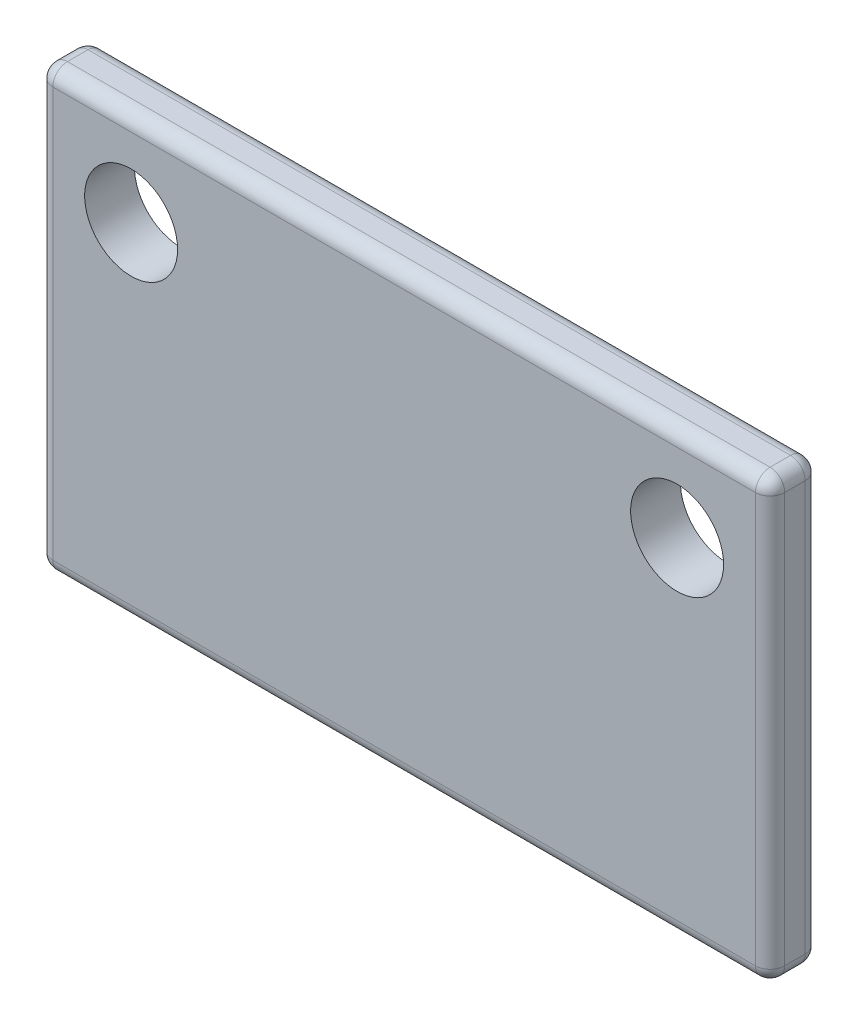
ISO-10303-21;
HEADER;
FILE_DESCRIPTION(('STEP AP214'),'2;1');
FILE_NAME('part.step','',(''),(''),'','','');
FILE_SCHEMA(('AUTOMOTIVE_DESIGN { 1 0 10303 214 1 1 1 1 }'));
ENDSEC;
DATA;
#1=APPLICATION_CONTEXT('core data for automotive mechanical design processes');
#2=APPLICATION_PROTOCOL_DEFINITION('international standard','automotive_design',2000,#1);
#3=PRODUCT_CONTEXT('',#1,'mechanical');
#4=PRODUCT('Part','Part','',(#3));
#5=PRODUCT_RELATED_PRODUCT_CATEGORY('part','',(#4));
#6=PRODUCT_DEFINITION_FORMATION('','',#4);
#7=PRODUCT_DEFINITION_CONTEXT('part definition',#1,'design');
#8=PRODUCT_DEFINITION('design','',#6,#7);
#9=PRODUCT_DEFINITION_SHAPE('','',#8);
#10=(LENGTH_UNIT() NAMED_UNIT(*) SI_UNIT(.MILLI.,.METRE.));
#11=(NAMED_UNIT(*) PLANE_ANGLE_UNIT() SI_UNIT($,.RADIAN.));
#12=(NAMED_UNIT(*) SI_UNIT($,.STERADIAN.) SOLID_ANGLE_UNIT());
#13=UNCERTAINTY_MEASURE_WITH_UNIT(LENGTH_MEASURE(1.E-05),#10,'distance_accuracy_value','');
#14=(GEOMETRIC_REPRESENTATION_CONTEXT(3) GLOBAL_UNCERTAINTY_ASSIGNED_CONTEXT((#13)) GLOBAL_UNIT_ASSIGNED_CONTEXT((#10,
#11,#12)) REPRESENTATION_CONTEXT('',''));
#15=CARTESIAN_POINT('',(0.,0.,0.));
#16=DIRECTION('',(0.,0.,1.));
#17=DIRECTION('',(1.,0.,0.));
#18=AXIS2_PLACEMENT_3D('',#15,#16,#17);
#19=CARTESIAN_POINT('',(-12.5,-7.5,1.7));
#20=DIRECTION('',(1.,0.,0.));
#21=DIRECTION('',(0.,0.,-1.));
#22=AXIS2_PLACEMENT_3D('',#19,#20,#21);
#23=PLANE('',#22);
#24=DIRECTION('',(0.,-1.,0.));
#25=VECTOR('',#24,1.);
#26=CARTESIAN_POINT('',(-12.5,7.5,1.2));
#27=LINE('',#26,#25);
#28=CARTESIAN_POINT('',(-12.5,-7.,1.2));
#29=VERTEX_POINT('',#28);
#30=CARTESIAN_POINT('',(-12.5,7.,1.2));
#31=VERTEX_POINT('',#30);
#32=EDGE_CURVE('E134',#29,#31,#27,.F.);
#33=ORIENTED_EDGE('',*,*,#32,.T.);
#34=DIRECTION('',(0.,0.,-1.));
#35=VECTOR('',#34,1.);
#36=CARTESIAN_POINT('',(-12.5,7.,1.7));
#37=LINE('',#36,#35);
#38=CARTESIAN_POINT('',(-12.5,7.,0.5));
#39=VERTEX_POINT('',#38);
#40=EDGE_CURVE('E130',#31,#39,#37,.T.);
#41=ORIENTED_EDGE('',*,*,#40,.T.);
#42=DIRECTION('',(0.,-1.,0.));
#43=VECTOR('',#42,1.);
#44=CARTESIAN_POINT('',(-12.5,-7.5,0.5));
#45=LINE('',#44,#43);
#46=CARTESIAN_POINT('',(-12.5,-7.,0.5));
#47=VERTEX_POINT('',#46);
#48=EDGE_CURVE('E125',#39,#47,#45,.T.);
#49=ORIENTED_EDGE('',*,*,#48,.T.);
#50=DIRECTION('',(0.,0.,-1.));
#51=VECTOR('',#50,1.);
#52=CARTESIAN_POINT('',(-12.5,-7.,1.7));
#53=LINE('',#52,#51);
#54=EDGE_CURVE('E127',#47,#29,#53,.F.);
#55=ORIENTED_EDGE('',*,*,#54,.T.);
#56=EDGE_LOOP('',(#33,#41,#49,#55));
#57=FACE_BOUND('',#56,.T.);
#58=ADVANCED_FACE('F33',(#57),#23,.F.);
#59=CARTESIAN_POINT('',(12.5,-7.5,1.7));
#60=DIRECTION('',(0.,1.,0.));
#61=DIRECTION('',(-1.,0.,0.));
#62=AXIS2_PLACEMENT_3D('',#59,#60,#61);
#63=PLANE('',#62);
#64=DIRECTION('',(1.,0.,0.));
#65=VECTOR('',#64,1.);
#66=CARTESIAN_POINT('',(12.5,-7.5,0.5));
#67=LINE('',#66,#65);
#68=CARTESIAN_POINT('',(-12.,-7.5,0.5));
#69=VERTEX_POINT('',#68);
#70=CARTESIAN_POINT('',(12.,-7.5,0.5));
#71=VERTEX_POINT('',#70);
#72=EDGE_CURVE('E238',#69,#71,#67,.T.);
#73=ORIENTED_EDGE('',*,*,#72,.T.);
#74=DIRECTION('',(0.,0.,-1.));
#75=VECTOR('',#74,1.);
#76=CARTESIAN_POINT('',(12.,-7.5,1.7));
#77=LINE('',#76,#75);
#78=CARTESIAN_POINT('',(12.,-7.5,1.2));
#79=VERTEX_POINT('',#78);
#80=EDGE_CURVE('E241',#71,#79,#77,.F.);
#81=ORIENTED_EDGE('',*,*,#80,.T.);
#82=DIRECTION('',(1.,0.,0.));
#83=VECTOR('',#82,1.);
#84=CARTESIAN_POINT('',(-12.5,-7.5,1.2));
#85=LINE('',#84,#83);
#86=CARTESIAN_POINT('',(-12.,-7.5,1.2));
#87=VERTEX_POINT('',#86);
#88=EDGE_CURVE('E236',#79,#87,#85,.F.);
#89=ORIENTED_EDGE('',*,*,#88,.T.);
#90=DIRECTION('',(0.,0.,-1.));
#91=VECTOR('',#90,1.);
#92=CARTESIAN_POINT('',(-12.,-7.5,1.7));
#93=LINE('',#92,#91);
#94=EDGE_CURVE('E234',#87,#69,#93,.T.);
#95=ORIENTED_EDGE('',*,*,#94,.T.);
#96=EDGE_LOOP('',(#73,#81,#89,#95));
#97=FACE_BOUND('',#96,.T.);
#98=ADVANCED_FACE('F303',(#97),#63,.F.);
#99=CARTESIAN_POINT('',(12.5,-7.5,1.7));
#100=DIRECTION('',(-1.,0.,0.));
#101=DIRECTION('',(0.,0.,1.));
#102=AXIS2_PLACEMENT_3D('',#99,#100,#101);
#103=PLANE('',#102);
#104=DIRECTION('',(0.,1.,0.));
#105=VECTOR('',#104,1.);
#106=CARTESIAN_POINT('',(12.5,-7.5,0.5));
#107=LINE('',#106,#105);
#108=CARTESIAN_POINT('',(12.5,-7.,0.5));
#109=VERTEX_POINT('',#108);
#110=CARTESIAN_POINT('',(12.5,7.,0.5));
#111=VERTEX_POINT('',#110);
#112=EDGE_CURVE('E247',#109,#111,#107,.T.);
#113=ORIENTED_EDGE('',*,*,#112,.T.);
#114=DIRECTION('',(0.,0.,-1.));
#115=VECTOR('',#114,1.);
#116=CARTESIAN_POINT('',(12.5,7.,1.7));
#117=LINE('',#116,#115);
#118=CARTESIAN_POINT('',(12.5,7.,1.2));
#119=VERTEX_POINT('',#118);
#120=EDGE_CURVE('E250',#111,#119,#117,.F.);
#121=ORIENTED_EDGE('',*,*,#120,.T.);
#122=DIRECTION('',(0.,1.,0.));
#123=VECTOR('',#122,1.);
#124=CARTESIAN_POINT('',(12.5,-7.5,1.2));
#125=LINE('',#124,#123);
#126=CARTESIAN_POINT('',(12.5,-7.,1.2));
#127=VERTEX_POINT('',#126);
#128=EDGE_CURVE('E245',#119,#127,#125,.F.);
#129=ORIENTED_EDGE('',*,*,#128,.T.);
#130=DIRECTION('',(0.,0.,-1.));
#131=VECTOR('',#130,1.);
#132=CARTESIAN_POINT('',(12.5,-7.,1.7));
#133=LINE('',#132,#131);
#134=EDGE_CURVE('E243',#127,#109,#133,.T.);
#135=ORIENTED_EDGE('',*,*,#134,.T.);
#136=EDGE_LOOP('',(#113,#121,#129,#135));
#137=FACE_BOUND('',#136,.T.);
#138=ADVANCED_FACE('F345',(#137),#103,.F.);
#139=CARTESIAN_POINT('',(12.5,7.5,1.7));
#140=DIRECTION('',(0.,-1.,0.));
#141=DIRECTION('',(1.,0.,0.));
#142=AXIS2_PLACEMENT_3D('',#139,#140,#141);
#143=PLANE('',#142);
#144=DIRECTION('',(-1.,0.,0.));
#145=VECTOR('',#144,1.);
#146=CARTESIAN_POINT('',(12.5,7.5,0.5));
#147=LINE('',#146,#145);
#148=CARTESIAN_POINT('',(12.,7.5,0.5));
#149=VERTEX_POINT('',#148);
#150=CARTESIAN_POINT('',(-12.,7.5,0.5));
#151=VERTEX_POINT('',#150);
#152=EDGE_CURVE('E222',#149,#151,#147,.T.);
#153=ORIENTED_EDGE('',*,*,#152,.T.);
#154=DIRECTION('',(0.,0.,-1.));
#155=VECTOR('',#154,1.);
#156=CARTESIAN_POINT('',(-12.,7.5,1.7));
#157=LINE('',#156,#155);
#158=CARTESIAN_POINT('',(-12.,7.5,1.2));
#159=VERTEX_POINT('',#158);
#160=EDGE_CURVE('E224',#151,#159,#157,.F.);
#161=ORIENTED_EDGE('',*,*,#160,.T.);
#162=DIRECTION('',(-1.,0.,0.));
#163=VECTOR('',#162,1.);
#164=CARTESIAN_POINT('',(12.5,7.5,1.2));
#165=LINE('',#164,#163);
#166=CARTESIAN_POINT('',(12.,7.5,1.2));
#167=VERTEX_POINT('',#166);
#168=EDGE_CURVE('E220',#159,#167,#165,.F.);
#169=ORIENTED_EDGE('',*,*,#168,.T.);
#170=DIRECTION('',(0.,0.,-1.));
#171=VECTOR('',#170,1.);
#172=CARTESIAN_POINT('',(12.,7.5,1.7));
#173=LINE('',#172,#171);
#174=EDGE_CURVE('E218',#167,#149,#173,.T.);
#175=ORIENTED_EDGE('',*,*,#174,.T.);
#176=EDGE_LOOP('',(#153,#161,#169,#175));
#177=FACE_BOUND('',#176,.T.);
#178=ADVANCED_FACE('F282',(#177),#143,.F.);
#179=CARTESIAN_POINT('',(0.,0.,1.7));
#180=DIRECTION('',(0.,0.,1.));
#181=DIRECTION('',(1.,0.,0.));
#182=AXIS2_PLACEMENT_3D('',#179,#180,#181);
#183=PLANE('',#182);
#184=DIRECTION('',(-1.,0.,0.));
#185=VECTOR('',#184,1.);
#186=CARTESIAN_POINT('',(-12.5,7.,1.7));
#187=LINE('',#186,#185);
#188=CARTESIAN_POINT('',(12.,7.,1.7));
#189=VERTEX_POINT('',#188);
#190=CARTESIAN_POINT('',(-12.,7.,1.7));
#191=VERTEX_POINT('',#190);
#192=EDGE_CURVE('E252',#189,#191,#187,.T.);
#193=ORIENTED_EDGE('',*,*,#192,.T.);
#194=DIRECTION('',(0.,-1.,0.));
#195=VECTOR('',#194,1.);
#196=CARTESIAN_POINT('',(-12.,-7.5,1.7));
#197=LINE('',#196,#195);
#198=CARTESIAN_POINT('',(-12.,-7.,1.7));
#199=VERTEX_POINT('',#198);
#200=EDGE_CURVE('E11',#191,#199,#197,.T.);
#201=ORIENTED_EDGE('',*,*,#200,.T.);
#202=DIRECTION('',(1.,0.,0.));
#203=VECTOR('',#202,1.);
#204=CARTESIAN_POINT('',(12.5,-7.,1.7));
#205=LINE('',#204,#203);
#206=CARTESIAN_POINT('',(12.,-7.,1.7));
#207=VERTEX_POINT('',#206);
#208=EDGE_CURVE('E42',#199,#207,#205,.T.);
#209=ORIENTED_EDGE('',*,*,#208,.T.);
#210=DIRECTION('',(0.,1.,0.));
#211=VECTOR('',#210,1.);
#212=CARTESIAN_POINT('',(12.,7.5,1.7));
#213=LINE('',#212,#211);
#214=EDGE_CURVE('E254',#207,#189,#213,.T.);
#215=ORIENTED_EDGE('',*,*,#214,.T.);
#216=EDGE_LOOP('',(#193,#201,#209,#215));
#217=FACE_BOUND('',#216,.T.);
#218=CARTESIAN_POINT('',(-9.325,4.325,1.7));
#219=DIRECTION('',(0.,0.,1.));
#220=DIRECTION('',(1.,0.,0.));
#221=AXIS2_PLACEMENT_3D('',#218,#219,#220);
#222=CIRCLE('',#221,1.5875);
#223=CARTESIAN_POINT('',(-7.7375,4.325,1.7));
#224=VERTEX_POINT('',#223);
#225=EDGE_CURVE('E212',#224,#224,#222,.T.);
#226=ORIENTED_EDGE('',*,*,#225,.F.);
#227=EDGE_LOOP('',(#226));
#228=FACE_BOUND('',#227,.T.);
#229=CARTESIAN_POINT('',(9.325,4.325,1.7));
#230=DIRECTION('',(0.,0.,1.));
#231=DIRECTION('',(1.,0.,0.));
#232=AXIS2_PLACEMENT_3D('',#229,#230,#231);
#233=CIRCLE('',#232,1.5875);
#234=CARTESIAN_POINT('',(10.9125,4.325,1.7));
#235=VERTEX_POINT('',#234);
#236=EDGE_CURVE('E201',#235,#235,#233,.T.);
#237=ORIENTED_EDGE('',*,*,#236,.F.);
#238=EDGE_LOOP('',(#237));
#239=FACE_BOUND('',#238,.T.);
#240=ADVANCED_FACE('F311',(#217,#228,#239),#183,.T.);
#241=CARTESIAN_POINT('',(0.,0.,0.));
#242=DIRECTION('',(0.,0.,1.));
#243=DIRECTION('',(1.,0.,0.));
#244=AXIS2_PLACEMENT_3D('',#241,#242,#243);
#245=PLANE('',#244);
#246=DIRECTION('',(1.,0.,0.));
#247=VECTOR('',#246,1.);
#248=CARTESIAN_POINT('',(0.,-7.,0.));
#249=LINE('',#248,#247);
#250=CARTESIAN_POINT('',(12.,-7.,0.));
#251=VERTEX_POINT('',#250);
#252=CARTESIAN_POINT('',(-12.,-7.,0.));
#253=VERTEX_POINT('',#252);
#254=EDGE_CURVE('E229',#251,#253,#249,.F.);
#255=ORIENTED_EDGE('',*,*,#254,.T.);
#256=DIRECTION('',(0.,-1.,0.));
#257=VECTOR('',#256,1.);
#258=CARTESIAN_POINT('',(-12.,0.,0.));
#259=LINE('',#258,#257);
#260=CARTESIAN_POINT('',(-12.,7.,0.));
#261=VERTEX_POINT('',#260);
#262=EDGE_CURVE('E157',#253,#261,#259,.F.);
#263=ORIENTED_EDGE('',*,*,#262,.T.);
#264=DIRECTION('',(-1.,0.,0.));
#265=VECTOR('',#264,1.);
#266=CARTESIAN_POINT('',(0.,7.,0.));
#267=LINE('',#266,#265);
#268=CARTESIAN_POINT('',(12.,7.,0.));
#269=VERTEX_POINT('',#268);
#270=EDGE_CURVE('E231',#261,#269,#267,.F.);
#271=ORIENTED_EDGE('',*,*,#270,.T.);
#272=DIRECTION('',(0.,1.,0.));
#273=VECTOR('',#272,1.);
#274=CARTESIAN_POINT('',(12.,0.,0.));
#275=LINE('',#274,#273);
#276=EDGE_CURVE('E227',#269,#251,#275,.F.);
#277=ORIENTED_EDGE('',*,*,#276,.T.);
#278=EDGE_LOOP('',(#255,#263,#271,#277));
#279=FACE_BOUND('',#278,.T.);
#280=CARTESIAN_POINT('',(-9.325,4.325,0.));
#281=DIRECTION('',(0.,0.,1.));
#282=DIRECTION('',(1.,0.,0.));
#283=AXIS2_PLACEMENT_3D('',#280,#281,#282);
#284=CIRCLE('',#283,1.5875);
#285=CARTESIAN_POINT('',(-7.7375,4.325,0.));
#286=VERTEX_POINT('',#285);
#287=EDGE_CURVE('E145',#286,#286,#284,.T.);
#288=ORIENTED_EDGE('',*,*,#287,.T.);
#289=EDGE_LOOP('',(#288));
#290=FACE_BOUND('',#289,.T.);
#291=CARTESIAN_POINT('',(9.325,4.325,0.));
#292=DIRECTION('',(0.,0.,1.));
#293=DIRECTION('',(1.,0.,0.));
#294=AXIS2_PLACEMENT_3D('',#291,#292,#293);
#295=CIRCLE('',#294,1.5875);
#296=CARTESIAN_POINT('',(10.9125,4.325,0.));
#297=VERTEX_POINT('',#296);
#298=EDGE_CURVE('E207',#297,#297,#295,.T.);
#299=ORIENTED_EDGE('',*,*,#298,.T.);
#300=EDGE_LOOP('',(#299));
#301=FACE_BOUND('',#300,.T.);
#302=ADVANCED_FACE('F296',(#279,#290,#301),#245,.F.);
#303=CARTESIAN_POINT('',(9.325,4.325,0.));
#304=DIRECTION('',(0.,0.,1.));
#305=DIRECTION('',(1.,0.,0.));
#306=AXIS2_PLACEMENT_3D('',#303,#304,#305);
#307=CYLINDRICAL_SURFACE('',#306,1.5875);
#308=ORIENTED_EDGE('',*,*,#298,.F.);
#309=EDGE_LOOP('',(#308));
#310=FACE_BOUND('',#309,.T.);
#311=ORIENTED_EDGE('',*,*,#236,.T.);
#312=EDGE_LOOP('',(#311));
#313=FACE_BOUND('',#312,.T.);
#314=ADVANCED_FACE('F506',(#310,#313),#307,.F.);
#315=CARTESIAN_POINT('',(-9.325,4.325,0.));
#316=DIRECTION('',(0.,0.,1.));
#317=DIRECTION('',(1.,0.,0.));
#318=AXIS2_PLACEMENT_3D('',#315,#316,#317);
#319=CYLINDRICAL_SURFACE('',#318,1.5875);
#320=ORIENTED_EDGE('',*,*,#287,.F.);
#321=EDGE_LOOP('',(#320));
#322=FACE_BOUND('',#321,.T.);
#323=ORIENTED_EDGE('',*,*,#225,.T.);
#324=EDGE_LOOP('',(#323));
#325=FACE_BOUND('',#324,.T.);
#326=ADVANCED_FACE('F497',(#322,#325),#319,.F.);
#327=CARTESIAN_POINT('',(12.,-7.,1.7));
#328=DIRECTION('',(0.,0.,-1.));
#329=DIRECTION('',(-1.,0.,0.));
#330=AXIS2_PLACEMENT_3D('',#327,#328,#329);
#331=CYLINDRICAL_SURFACE('',#330,0.5);
#332=CARTESIAN_POINT('',(12.,-7.,1.2));
#333=DIRECTION('',(0.,0.,1.));
#334=DIRECTION('',(1.,0.,0.));
#335=AXIS2_PLACEMENT_3D('',#332,#333,#334);
#336=CIRCLE('',#335,0.5);
#337=EDGE_CURVE('E37',#79,#127,#336,.T.);
#338=ORIENTED_EDGE('',*,*,#337,.F.);
#339=ORIENTED_EDGE('',*,*,#80,.F.);
#340=CARTESIAN_POINT('',(12.,-7.,0.5));
#341=DIRECTION('',(0.,0.,-1.));
#342=DIRECTION('',(-1.,0.,0.));
#343=AXIS2_PLACEMENT_3D('',#340,#341,#342);
#344=CIRCLE('',#343,0.5);
#345=EDGE_CURVE('E193',#109,#71,#344,.T.);
#346=ORIENTED_EDGE('',*,*,#345,.F.);
#347=ORIENTED_EDGE('',*,*,#134,.F.);
#348=EDGE_LOOP('',(#338,#339,#346,#347));
#349=FACE_BOUND('',#348,.T.);
#350=ADVANCED_FACE('F35',(#349),#331,.T.);
#351=CARTESIAN_POINT('',(12.,-7.,1.2));
#352=DIRECTION('',(0.,0.,1.));
#353=DIRECTION('',(1.,0.,0.));
#354=AXIS2_PLACEMENT_3D('',#351,#352,#353);
#355=SPHERICAL_SURFACE('',#354,0.5);
#356=CARTESIAN_POINT('',(12.,-7.,1.2));
#357=DIRECTION('',(1.,0.,0.));
#358=DIRECTION('',(0.,0.,-1.));
#359=AXIS2_PLACEMENT_3D('',#356,#357,#358);
#360=CIRCLE('',#359,0.5);
#361=EDGE_CURVE('E189',#79,#207,#360,.F.);
#362=ORIENTED_EDGE('',*,*,#361,.F.);
#363=ORIENTED_EDGE('',*,*,#337,.T.);
#364=CARTESIAN_POINT('',(12.,-7.,1.2));
#365=DIRECTION('',(0.,-1.,0.));
#366=DIRECTION('',(0.,0.,-1.));
#367=AXIS2_PLACEMENT_3D('',#364,#365,#366);
#368=CIRCLE('',#367,0.5);
#369=EDGE_CURVE('E191',#207,#127,#368,.F.);
#370=ORIENTED_EDGE('',*,*,#369,.F.);
#371=EDGE_LOOP('',(#362,#363,#370));
#372=FACE_BOUND('',#371,.T.);
#373=ADVANCED_FACE('F333',(#372),#355,.T.);
#374=CARTESIAN_POINT('',(12.,-7.,0.5));
#375=DIRECTION('',(0.,0.,1.));
#376=DIRECTION('',(1.,0.,0.));
#377=AXIS2_PLACEMENT_3D('',#374,#375,#376);
#378=SPHERICAL_SURFACE('',#377,0.5);
#379=CARTESIAN_POINT('',(12.,-7.,0.5));
#380=DIRECTION('',(0.,-1.,0.));
#381=DIRECTION('',(0.,0.,-1.));
#382=AXIS2_PLACEMENT_3D('',#379,#380,#381);
#383=CIRCLE('',#382,0.5);
#384=EDGE_CURVE('E184',#109,#251,#383,.F.);
#385=ORIENTED_EDGE('',*,*,#384,.F.);
#386=ORIENTED_EDGE('',*,*,#345,.T.);
#387=CARTESIAN_POINT('',(12.,-7.,0.5));
#388=DIRECTION('',(1.,0.,0.));
#389=DIRECTION('',(0.,0.,-1.));
#390=AXIS2_PLACEMENT_3D('',#387,#388,#389);
#391=CIRCLE('',#390,0.5);
#392=EDGE_CURVE('E187',#251,#71,#391,.F.);
#393=ORIENTED_EDGE('',*,*,#392,.F.);
#394=EDGE_LOOP('',(#385,#386,#393));
#395=FACE_BOUND('',#394,.T.);
#396=ADVANCED_FACE('F331',(#395),#378,.T.);
#397=CARTESIAN_POINT('',(12.,0.,1.2));
#398=DIRECTION('',(0.,-1.,0.));
#399=DIRECTION('',(0.,0.,-1.));
#400=AXIS2_PLACEMENT_3D('',#397,#398,#399);
#401=CYLINDRICAL_SURFACE('',#400,0.5);
#402=ORIENTED_EDGE('',*,*,#369,.T.);
#403=ORIENTED_EDGE('',*,*,#128,.F.);
#404=CARTESIAN_POINT('',(12.,7.,1.2));
#405=DIRECTION('',(0.,1.,0.));
#406=DIRECTION('',(0.,0.,1.));
#407=AXIS2_PLACEMENT_3D('',#404,#405,#406);
#408=CIRCLE('',#407,0.5);
#409=EDGE_CURVE('E178',#189,#119,#408,.T.);
#410=ORIENTED_EDGE('',*,*,#409,.F.);
#411=ORIENTED_EDGE('',*,*,#214,.F.);
#412=EDGE_LOOP('',(#402,#403,#410,#411));
#413=FACE_BOUND('',#412,.T.);
#414=ADVANCED_FACE('F317',(#413),#401,.T.);
#415=CARTESIAN_POINT('',(0.,-7.,1.2));
#416=DIRECTION('',(-1.,0.,0.));
#417=DIRECTION('',(0.,-1.,0.));
#418=AXIS2_PLACEMENT_3D('',#415,#416,#417);
#419=CYLINDRICAL_SURFACE('',#418,0.5);
#420=ORIENTED_EDGE('',*,*,#361,.T.);
#421=ORIENTED_EDGE('',*,*,#208,.F.);
#422=CARTESIAN_POINT('',(-12.,-7.,1.2));
#423=DIRECTION('',(-1.,0.,0.));
#424=DIRECTION('',(0.,0.,1.));
#425=AXIS2_PLACEMENT_3D('',#422,#423,#424);
#426=CIRCLE('',#425,0.5);
#427=EDGE_CURVE('E176',#87,#199,#426,.T.);
#428=ORIENTED_EDGE('',*,*,#427,.F.);
#429=ORIENTED_EDGE('',*,*,#88,.F.);
#430=EDGE_LOOP('',(#420,#421,#428,#429));
#431=FACE_BOUND('',#430,.T.);
#432=ADVANCED_FACE('F307',(#431),#419,.T.);
#433=CARTESIAN_POINT('',(-12.,-7.,1.7));
#434=DIRECTION('',(0.,0.,-1.));
#435=DIRECTION('',(-1.,0.,0.));
#436=AXIS2_PLACEMENT_3D('',#433,#434,#435);
#437=CYLINDRICAL_SURFACE('',#436,0.5);
#438=CARTESIAN_POINT('',(-12.,-7.,0.5));
#439=DIRECTION('',(0.,0.,-1.));
#440=DIRECTION('',(-1.,0.,0.));
#441=AXIS2_PLACEMENT_3D('',#438,#439,#440);
#442=CIRCLE('',#441,0.5);
#443=EDGE_CURVE('E141',#69,#47,#442,.T.);
#444=ORIENTED_EDGE('',*,*,#443,.F.);
#445=ORIENTED_EDGE('',*,*,#94,.F.);
#446=CARTESIAN_POINT('',(-12.,-7.,1.2));
#447=DIRECTION('',(0.,0.,1.));
#448=DIRECTION('',(1.,0.,0.));
#449=AXIS2_PLACEMENT_3D('',#446,#447,#448);
#450=CIRCLE('',#449,0.5);
#451=EDGE_CURVE('E144',#29,#87,#450,.T.);
#452=ORIENTED_EDGE('',*,*,#451,.F.);
#453=ORIENTED_EDGE('',*,*,#54,.F.);
#454=EDGE_LOOP('',(#444,#445,#452,#453));
#455=FACE_BOUND('',#454,.T.);
#456=ADVANCED_FACE('F139',(#455),#437,.T.);
#457=CARTESIAN_POINT('',(12.5,-7.,0.5));
#458=DIRECTION('',(1.,0.,0.));
#459=DIRECTION('',(0.,1.,0.));
#460=AXIS2_PLACEMENT_3D('',#457,#458,#459);
#461=CYLINDRICAL_SURFACE('',#460,0.5);
#462=ORIENTED_EDGE('',*,*,#392,.T.);
#463=ORIENTED_EDGE('',*,*,#72,.F.);
#464=CARTESIAN_POINT('',(-12.,-7.,0.5));
#465=DIRECTION('',(-1.,0.,0.));
#466=DIRECTION('',(0.,0.,1.));
#467=AXIS2_PLACEMENT_3D('',#464,#465,#466);
#468=CIRCLE('',#467,0.5);
#469=EDGE_CURVE('E153',#253,#69,#468,.T.);
#470=ORIENTED_EDGE('',*,*,#469,.F.);
#471=ORIENTED_EDGE('',*,*,#254,.F.);
#472=EDGE_LOOP('',(#462,#463,#470,#471));
#473=FACE_BOUND('',#472,.T.);
#474=ADVANCED_FACE('F301',(#473),#461,.T.);
#475=CARTESIAN_POINT('',(12.,-7.5,0.5));
#476=DIRECTION('',(0.,1.,0.));
#477=DIRECTION('',(0.,0.,1.));
#478=AXIS2_PLACEMENT_3D('',#475,#476,#477);
#479=CYLINDRICAL_SURFACE('',#478,0.5);
#480=ORIENTED_EDGE('',*,*,#384,.T.);
#481=ORIENTED_EDGE('',*,*,#276,.F.);
#482=CARTESIAN_POINT('',(12.,7.,0.5));
#483=DIRECTION('',(0.,1.,0.));
#484=DIRECTION('',(0.,0.,1.));
#485=AXIS2_PLACEMENT_3D('',#482,#483,#484);
#486=CIRCLE('',#485,0.5);
#487=EDGE_CURVE('E171',#111,#269,#486,.T.);
#488=ORIENTED_EDGE('',*,*,#487,.F.);
#489=ORIENTED_EDGE('',*,*,#112,.F.);
#490=EDGE_LOOP('',(#480,#481,#488,#489));
#491=FACE_BOUND('',#490,.T.);
#492=ADVANCED_FACE('F330',(#491),#479,.T.);
#493=CARTESIAN_POINT('',(12.,7.,1.7));
#494=DIRECTION('',(0.,0.,-1.));
#495=DIRECTION('',(-1.,0.,0.));
#496=AXIS2_PLACEMENT_3D('',#493,#494,#495);
#497=CYLINDRICAL_SURFACE('',#496,0.5);
#498=CARTESIAN_POINT('',(12.,7.,1.2));
#499=DIRECTION('',(0.,0.,1.));
#500=DIRECTION('',(1.,0.,0.));
#501=AXIS2_PLACEMENT_3D('',#498,#499,#500);
#502=CIRCLE('',#501,0.5);
#503=EDGE_CURVE('E181',#119,#167,#502,.T.);
#504=ORIENTED_EDGE('',*,*,#503,.F.);
#505=ORIENTED_EDGE('',*,*,#120,.F.);
#506=CARTESIAN_POINT('',(12.,7.,0.5));
#507=DIRECTION('',(0.,0.,-1.));
#508=DIRECTION('',(-1.,0.,0.));
#509=AXIS2_PLACEMENT_3D('',#506,#507,#508);
#510=CIRCLE('',#509,0.5);
#511=EDGE_CURVE('E169',#149,#111,#510,.T.);
#512=ORIENTED_EDGE('',*,*,#511,.F.);
#513=ORIENTED_EDGE('',*,*,#174,.F.);
#514=EDGE_LOOP('',(#504,#505,#512,#513));
#515=FACE_BOUND('',#514,.T.);
#516=ADVANCED_FACE('F323',(#515),#497,.T.);
#517=CARTESIAN_POINT('',(12.,7.,1.2));
#518=DIRECTION('',(0.,0.,1.));
#519=DIRECTION('',(1.,0.,0.));
#520=AXIS2_PLACEMENT_3D('',#517,#518,#519);
#521=SPHERICAL_SURFACE('',#520,0.5);
#522=ORIENTED_EDGE('',*,*,#409,.T.);
#523=ORIENTED_EDGE('',*,*,#503,.T.);
#524=CARTESIAN_POINT('',(12.,7.,1.2));
#525=DIRECTION('',(1.,0.,0.));
#526=DIRECTION('',(0.,0.,-1.));
#527=AXIS2_PLACEMENT_3D('',#524,#525,#526);
#528=CIRCLE('',#527,0.5);
#529=EDGE_CURVE('E160',#189,#167,#528,.F.);
#530=ORIENTED_EDGE('',*,*,#529,.F.);
#531=EDGE_LOOP('',(#522,#523,#530));
#532=FACE_BOUND('',#531,.T.);
#533=ADVANCED_FACE('F320',(#532),#521,.T.);
#534=CARTESIAN_POINT('',(-12.,-7.,1.2));
#535=DIRECTION('',(0.,0.,1.));
#536=DIRECTION('',(1.,0.,0.));
#537=AXIS2_PLACEMENT_3D('',#534,#535,#536);
#538=SPHERICAL_SURFACE('',#537,0.5);
#539=ORIENTED_EDGE('',*,*,#451,.T.);
#540=ORIENTED_EDGE('',*,*,#427,.T.);
#541=CARTESIAN_POINT('',(-12.,-7.,1.2));
#542=DIRECTION('',(0.,-1.,0.));
#543=DIRECTION('',(0.,0.,-1.));
#544=AXIS2_PLACEMENT_3D('',#541,#542,#543);
#545=CIRCLE('',#544,0.5);
#546=EDGE_CURVE('E50',#29,#199,#545,.F.);
#547=ORIENTED_EDGE('',*,*,#546,.F.);
#548=EDGE_LOOP('',(#539,#540,#547));
#549=FACE_BOUND('',#548,.T.);
#550=ADVANCED_FACE('F309',(#549),#538,.T.);
#551=CARTESIAN_POINT('',(-12.,-7.,0.5));
#552=DIRECTION('',(0.,0.,1.));
#553=DIRECTION('',(1.,0.,0.));
#554=AXIS2_PLACEMENT_3D('',#551,#552,#553);
#555=SPHERICAL_SURFACE('',#554,0.5);
#556=ORIENTED_EDGE('',*,*,#469,.T.);
#557=ORIENTED_EDGE('',*,*,#443,.T.);
#558=CARTESIAN_POINT('',(-12.,-7.,0.5));
#559=DIRECTION('',(0.,-1.,0.));
#560=DIRECTION('',(0.,0.,-1.));
#561=AXIS2_PLACEMENT_3D('',#558,#559,#560);
#562=CIRCLE('',#561,0.5);
#563=EDGE_CURVE('E150',#253,#47,#562,.F.);
#564=ORIENTED_EDGE('',*,*,#563,.F.);
#565=EDGE_LOOP('',(#556,#557,#564));
#566=FACE_BOUND('',#565,.T.);
#567=ADVANCED_FACE('F149',(#566),#555,.T.);
#568=CARTESIAN_POINT('',(12.,7.,0.5));
#569=DIRECTION('',(0.,0.,1.));
#570=DIRECTION('',(1.,0.,0.));
#571=AXIS2_PLACEMENT_3D('',#568,#569,#570);
#572=SPHERICAL_SURFACE('',#571,0.5);
#573=ORIENTED_EDGE('',*,*,#511,.T.);
#574=ORIENTED_EDGE('',*,*,#487,.T.);
#575=CARTESIAN_POINT('',(12.,7.,0.5));
#576=DIRECTION('',(1.,0.,0.));
#577=DIRECTION('',(0.,0.,-1.));
#578=AXIS2_PLACEMENT_3D('',#575,#576,#577);
#579=CIRCLE('',#578,0.5);
#580=EDGE_CURVE('E158',#149,#269,#579,.F.);
#581=ORIENTED_EDGE('',*,*,#580,.F.);
#582=EDGE_LOOP('',(#573,#574,#581));
#583=FACE_BOUND('',#582,.T.);
#584=ADVANCED_FACE('F327',(#583),#572,.T.);
#585=CARTESIAN_POINT('',(0.,7.,1.2));
#586=DIRECTION('',(1.,0.,0.));
#587=DIRECTION('',(0.,1.,0.));
#588=AXIS2_PLACEMENT_3D('',#585,#586,#587);
#589=CYLINDRICAL_SURFACE('',#588,0.5);
#590=ORIENTED_EDGE('',*,*,#529,.T.);
#591=ORIENTED_EDGE('',*,*,#168,.F.);
#592=CARTESIAN_POINT('',(-12.,7.,1.2));
#593=DIRECTION('',(-1.,0.,0.));
#594=DIRECTION('',(0.,0.,1.));
#595=AXIS2_PLACEMENT_3D('',#592,#593,#594);
#596=CIRCLE('',#595,0.5);
#597=EDGE_CURVE('E163',#191,#159,#596,.T.);
#598=ORIENTED_EDGE('',*,*,#597,.F.);
#599=ORIENTED_EDGE('',*,*,#192,.F.);
#600=EDGE_LOOP('',(#590,#591,#598,#599));
#601=FACE_BOUND('',#600,.T.);
#602=ADVANCED_FACE('F277',(#601),#589,.T.);
#603=CARTESIAN_POINT('',(-12.,0.,1.2));
#604=DIRECTION('',(0.,1.,0.));
#605=DIRECTION('',(0.,0.,1.));
#606=AXIS2_PLACEMENT_3D('',#603,#604,#605);
#607=CYLINDRICAL_SURFACE('',#606,0.5);
#608=ORIENTED_EDGE('',*,*,#546,.T.);
#609=ORIENTED_EDGE('',*,*,#200,.F.);
#610=CARTESIAN_POINT('',(-12.,7.,1.2));
#611=DIRECTION('',(0.,1.,0.));
#612=DIRECTION('',(0.,0.,1.));
#613=AXIS2_PLACEMENT_3D('',#610,#611,#612);
#614=CIRCLE('',#613,0.5);
#615=EDGE_CURVE('E266',#31,#191,#614,.T.);
#616=ORIENTED_EDGE('',*,*,#615,.F.);
#617=ORIENTED_EDGE('',*,*,#32,.F.);
#618=EDGE_LOOP('',(#608,#609,#616,#617));
#619=FACE_BOUND('',#618,.T.);
#620=ADVANCED_FACE('F310',(#619),#607,.T.);
#621=CARTESIAN_POINT('',(-12.,-7.5,0.5));
#622=DIRECTION('',(0.,-1.,0.));
#623=DIRECTION('',(0.,0.,-1.));
#624=AXIS2_PLACEMENT_3D('',#621,#622,#623);
#625=CYLINDRICAL_SURFACE('',#624,0.5);
#626=ORIENTED_EDGE('',*,*,#563,.T.);
#627=ORIENTED_EDGE('',*,*,#48,.F.);
#628=CARTESIAN_POINT('',(-12.,7.,0.5));
#629=DIRECTION('',(0.,1.,0.));
#630=DIRECTION('',(0.,0.,1.));
#631=AXIS2_PLACEMENT_3D('',#628,#629,#630);
#632=CIRCLE('',#631,0.5);
#633=EDGE_CURVE('E263',#261,#39,#632,.T.);
#634=ORIENTED_EDGE('',*,*,#633,.F.);
#635=ORIENTED_EDGE('',*,*,#262,.F.);
#636=EDGE_LOOP('',(#626,#627,#634,#635));
#637=FACE_BOUND('',#636,.T.);
#638=ADVANCED_FACE('F155',(#637),#625,.T.);
#639=CARTESIAN_POINT('',(12.5,7.,0.5));
#640=DIRECTION('',(-1.,0.,0.));
#641=DIRECTION('',(0.,-1.,0.));
#642=AXIS2_PLACEMENT_3D('',#639,#640,#641);
#643=CYLINDRICAL_SURFACE('',#642,0.5);
#644=ORIENTED_EDGE('',*,*,#580,.T.);
#645=ORIENTED_EDGE('',*,*,#270,.F.);
#646=CARTESIAN_POINT('',(-12.,7.,0.5));
#647=DIRECTION('',(-1.,0.,0.));
#648=DIRECTION('',(0.,0.,1.));
#649=AXIS2_PLACEMENT_3D('',#646,#647,#648);
#650=CIRCLE('',#649,0.5);
#651=EDGE_CURVE('E261',#151,#261,#650,.T.);
#652=ORIENTED_EDGE('',*,*,#651,.F.);
#653=ORIENTED_EDGE('',*,*,#152,.F.);
#654=EDGE_LOOP('',(#644,#645,#652,#653));
#655=FACE_BOUND('',#654,.T.);
#656=ADVANCED_FACE('F292',(#655),#643,.T.);
#657=CARTESIAN_POINT('',(-12.,7.,1.2));
#658=DIRECTION('',(0.,0.,1.));
#659=DIRECTION('',(1.,0.,0.));
#660=AXIS2_PLACEMENT_3D('',#657,#658,#659);
#661=SPHERICAL_SURFACE('',#660,0.5);
#662=ORIENTED_EDGE('',*,*,#615,.T.);
#663=ORIENTED_EDGE('',*,*,#597,.T.);
#664=CARTESIAN_POINT('',(-12.,7.,1.2));
#665=DIRECTION('',(0.,0.,1.));
#666=DIRECTION('',(1.,0.,0.));
#667=AXIS2_PLACEMENT_3D('',#664,#665,#666);
#668=CIRCLE('',#667,0.5);
#669=EDGE_CURVE('E259',#31,#159,#668,.F.);
#670=ORIENTED_EDGE('',*,*,#669,.F.);
#671=EDGE_LOOP('',(#662,#663,#670));
#672=FACE_BOUND('',#671,.T.);
#673=ADVANCED_FACE('F273',(#672),#661,.T.);
#674=CARTESIAN_POINT('',(-12.,7.,0.5));
#675=DIRECTION('',(0.,0.,1.));
#676=DIRECTION('',(1.,0.,0.));
#677=AXIS2_PLACEMENT_3D('',#674,#675,#676);
#678=SPHERICAL_SURFACE('',#677,0.5);
#679=ORIENTED_EDGE('',*,*,#651,.T.);
#680=ORIENTED_EDGE('',*,*,#633,.T.);
#681=CARTESIAN_POINT('',(-12.,7.,0.5));
#682=DIRECTION('',(0.,0.,-1.));
#683=DIRECTION('',(-1.,0.,0.));
#684=AXIS2_PLACEMENT_3D('',#681,#682,#683);
#685=CIRCLE('',#684,0.5);
#686=EDGE_CURVE('E257',#151,#39,#685,.F.);
#687=ORIENTED_EDGE('',*,*,#686,.F.);
#688=EDGE_LOOP('',(#679,#680,#687));
#689=FACE_BOUND('',#688,.T.);
#690=ADVANCED_FACE('F289',(#689),#678,.T.);
#691=CARTESIAN_POINT('',(-12.,7.,1.7));
#692=DIRECTION('',(0.,0.,-1.));
#693=DIRECTION('',(-1.,0.,0.));
#694=AXIS2_PLACEMENT_3D('',#691,#692,#693);
#695=CYLINDRICAL_SURFACE('',#694,0.5);
#696=ORIENTED_EDGE('',*,*,#669,.T.);
#697=ORIENTED_EDGE('',*,*,#160,.F.);
#698=ORIENTED_EDGE('',*,*,#686,.T.);
#699=ORIENTED_EDGE('',*,*,#40,.F.);
#700=EDGE_LOOP('',(#696,#697,#698,#699));
#701=FACE_BOUND('',#700,.T.);
#702=ADVANCED_FACE('F287',(#701),#695,.T.);
#703=CLOSED_SHELL('',(#58,#98,#138,#178,#240,#302,#314,#326,#350,#373,#396,#414,#432,#456,#474,
#492,#516,#533,#550,#567,#584,#602,#620,#638,#656,#673,#690,#702));
#704=MANIFOLD_SOLID_BREP('B2',#703);
#705=ADVANCED_BREP_SHAPE_REPRESENTATION('',(#18,#704),#14);
#706=SHAPE_DEFINITION_REPRESENTATION(#9,#705);
ENDSEC;
END-ISO-10303-21;
